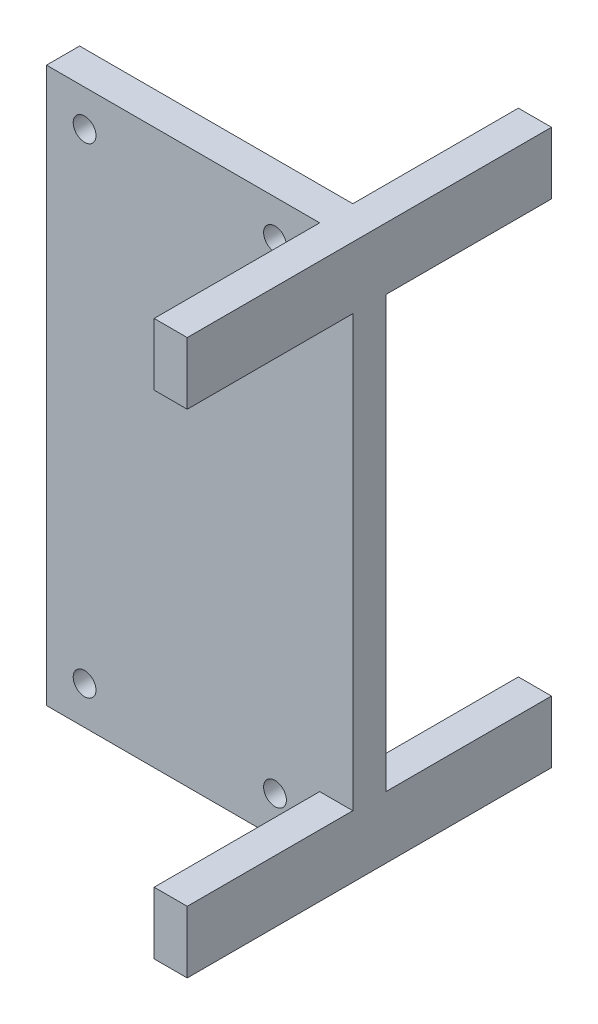
ISO-10303-21;
HEADER;
FILE_DESCRIPTION(('STEP AP214'),'2;1');
FILE_NAME('part.step','',(''),(''),'','','');
FILE_SCHEMA(('AUTOMOTIVE_DESIGN { 1 0 10303 214 1 1 1 1 }'));
ENDSEC;
DATA;
#1=APPLICATION_CONTEXT('core data for automotive mechanical design processes');
#2=APPLICATION_PROTOCOL_DEFINITION('international standard','automotive_design',2000,#1);
#3=PRODUCT_CONTEXT('',#1,'mechanical');
#4=PRODUCT('Part','Part','',(#3));
#5=PRODUCT_RELATED_PRODUCT_CATEGORY('part','',(#4));
#6=PRODUCT_DEFINITION_FORMATION('','',#4);
#7=PRODUCT_DEFINITION_CONTEXT('part definition',#1,'design');
#8=PRODUCT_DEFINITION('design','',#6,#7);
#9=PRODUCT_DEFINITION_SHAPE('','',#8);
#10=(LENGTH_UNIT() NAMED_UNIT(*) SI_UNIT(.MILLI.,.METRE.));
#11=(NAMED_UNIT(*) PLANE_ANGLE_UNIT() SI_UNIT($,.RADIAN.));
#12=(NAMED_UNIT(*) SI_UNIT($,.STERADIAN.) SOLID_ANGLE_UNIT());
#13=UNCERTAINTY_MEASURE_WITH_UNIT(LENGTH_MEASURE(1.E-05),#10,'distance_accuracy_value','');
#14=(GEOMETRIC_REPRESENTATION_CONTEXT(3) GLOBAL_UNCERTAINTY_ASSIGNED_CONTEXT((#13)) GLOBAL_UNIT_ASSIGNED_CONTEXT((#10,
#11,#12)) REPRESENTATION_CONTEXT('',''));
#15=CARTESIAN_POINT('',(0.,0.,0.));
#16=DIRECTION('',(0.,0.,1.));
#17=DIRECTION('',(1.,0.,0.));
#18=AXIS2_PLACEMENT_3D('',#15,#16,#17);
#19=CARTESIAN_POINT('',(0.,0.,0.));
#20=DIRECTION('',(0.,0.,1.));
#21=DIRECTION('',(1.,0.,0.));
#22=AXIS2_PLACEMENT_3D('',#19,#20,#21);
#23=PLANE('',#22);
#24=CARTESIAN_POINT('',(4.60000521271603,62.5999960758975,0.));
#25=DIRECTION('',(0.,0.,1.));
#26=DIRECTION('',(1.,0.,0.));
#27=AXIS2_PLACEMENT_3D('',#24,#25,#26);
#28=CIRCLE('',#27,1.37500005417229);
#29=CARTESIAN_POINT('',(5.97500526688832,62.5999960758975,0.));
#30=VERTEX_POINT('',#29);
#31=EDGE_CURVE('E331',#30,#30,#28,.T.);
#32=ORIENTED_EDGE('',*,*,#31,.T.);
#33=EDGE_LOOP('',(#32));
#34=FACE_BOUND('',#33,.T.);
#35=CARTESIAN_POINT('',(27.6000035015643,62.5999960758975,0.));
#36=DIRECTION('',(0.,0.,1.));
#37=DIRECTION('',(1.,0.,0.));
#38=AXIS2_PLACEMENT_3D('',#35,#36,#37);
#39=CIRCLE('',#38,1.37499760182344);
#40=CARTESIAN_POINT('',(28.9750011033877,62.5999960758975,0.));
#41=VERTEX_POINT('',#40);
#42=EDGE_CURVE('E325',#41,#41,#39,.T.);
#43=ORIENTED_EDGE('',*,*,#42,.T.);
#44=EDGE_LOOP('',(#43));
#45=FACE_BOUND('',#44,.T.);
#46=CARTESIAN_POINT('',(4.59999689017492,4.59999657961699,0.));
#47=DIRECTION('',(0.,0.,1.));
#48=DIRECTION('',(1.,0.,0.));
#49=AXIS2_PLACEMENT_3D('',#46,#47,#48);
#50=CIRCLE('',#49,1.37500005133197);
#51=CARTESIAN_POINT('',(5.97499694150688,4.59999657961699,0.));
#52=VERTEX_POINT('',#51);
#53=EDGE_CURVE('E317',#52,#52,#50,.T.);
#54=ORIENTED_EDGE('',*,*,#53,.T.);
#55=EDGE_LOOP('',(#54));
#56=FACE_BOUND('',#55,.T.);
#57=CARTESIAN_POINT('',(27.6000035015643,4.59999657961699,0.));
#58=DIRECTION('',(0.,0.,1.));
#59=DIRECTION('',(1.,0.,0.));
#60=AXIS2_PLACEMENT_3D('',#57,#58,#59);
#61=CIRCLE('',#60,1.37500106569427);
#62=CARTESIAN_POINT('',(28.9750045672586,4.59999657961699,0.));
#63=VERTEX_POINT('',#62);
#64=EDGE_CURVE('E318',#63,#63,#61,.T.);
#65=ORIENTED_EDGE('',*,*,#64,.T.);
#66=EDGE_LOOP('',(#65));
#67=FACE_BOUND('',#66,.T.);
#68=DIRECTION('',(1.,0.,0.));
#69=VECTOR('',#68,1.);
#70=CARTESIAN_POINT('',(33.,7.5,0.));
#71=LINE('',#70,#69);
#72=CARTESIAN_POINT('',(33.,7.5,0.));
#73=VERTEX_POINT('',#72);
#74=CARTESIAN_POINT('',(37.,7.5,0.));
#75=VERTEX_POINT('',#74);
#76=EDGE_CURVE('E254',#73,#75,#71,.T.);
#77=ORIENTED_EDGE('',*,*,#76,.F.);
#78=DIRECTION('',(0.,-1.,0.));
#79=VECTOR('',#78,1.);
#80=CARTESIAN_POINT('',(33.,7.5,0.));
#81=LINE('',#80,#79);
#82=CARTESIAN_POINT('',(33.,0.,0.));
#83=VERTEX_POINT('',#82);
#84=EDGE_CURVE('E267',#73,#83,#81,.T.);
#85=ORIENTED_EDGE('',*,*,#84,.T.);
#86=DIRECTION('',(1.,0.,0.));
#87=VECTOR('',#86,1.);
#88=CARTESIAN_POINT('',(0.,0.,0.));
#89=LINE('',#88,#87);
#90=CARTESIAN_POINT('',(0.,0.,0.));
#91=VERTEX_POINT('',#90);
#92=EDGE_CURVE('E352',#91,#83,#89,.T.);
#93=ORIENTED_EDGE('',*,*,#92,.F.);
#94=DIRECTION('',(0.,1.,0.));
#95=VECTOR('',#94,1.);
#96=CARTESIAN_POINT('',(0.,0.,0.));
#97=LINE('',#96,#95);
#98=CARTESIAN_POINT('',(0.,67.,0.));
#99=VERTEX_POINT('',#98);
#100=EDGE_CURVE('E344',#91,#99,#97,.T.);
#101=ORIENTED_EDGE('',*,*,#100,.T.);
#102=DIRECTION('',(1.,0.,0.));
#103=VECTOR('',#102,1.);
#104=CARTESIAN_POINT('',(0.,67.,0.));
#105=LINE('',#104,#103);
#106=CARTESIAN_POINT('',(33.,67.,0.));
#107=VERTEX_POINT('',#106);
#108=EDGE_CURVE('E337',#99,#107,#105,.T.);
#109=ORIENTED_EDGE('',*,*,#108,.T.);
#110=DIRECTION('',(0.,1.,0.));
#111=VECTOR('',#110,1.);
#112=CARTESIAN_POINT('',(33.,59.5,0.));
#113=LINE('',#112,#111);
#114=CARTESIAN_POINT('',(33.,59.5,0.));
#115=VERTEX_POINT('',#114);
#116=EDGE_CURVE('E247',#115,#107,#113,.T.);
#117=ORIENTED_EDGE('',*,*,#116,.F.);
#118=DIRECTION('',(1.,0.,0.));
#119=VECTOR('',#118,1.);
#120=CARTESIAN_POINT('',(33.,59.5,0.));
#121=LINE('',#120,#119);
#122=CARTESIAN_POINT('',(37.,59.5,0.));
#123=VERTEX_POINT('',#122);
#124=EDGE_CURVE('E234',#115,#123,#121,.T.);
#125=ORIENTED_EDGE('',*,*,#124,.T.);
#126=DIRECTION('',(0.,1.,0.));
#127=VECTOR('',#126,1.);
#128=CARTESIAN_POINT('',(37.,0.,0.));
#129=LINE('',#128,#127);
#130=EDGE_CURVE('E239',#75,#123,#129,.T.);
#131=ORIENTED_EDGE('',*,*,#130,.F.);
#132=EDGE_LOOP('',(#77,#85,#93,#101,#109,#117,#125,#131));
#133=FACE_BOUND('',#132,.T.);
#134=ADVANCED_FACE('F99',(#34,#45,#56,#67,#133),#23,.F.);
#135=CARTESIAN_POINT('',(0.,0.,4.));
#136=DIRECTION('',(0.,0.,1.));
#137=DIRECTION('',(1.,0.,0.));
#138=AXIS2_PLACEMENT_3D('',#135,#136,#137);
#139=PLANE('',#138);
#140=DIRECTION('',(0.,-1.,0.));
#141=VECTOR('',#140,1.);
#142=CARTESIAN_POINT('',(33.,7.5,4.));
#143=LINE('',#142,#141);
#144=CARTESIAN_POINT('',(33.,7.5,4.));
#145=VERTEX_POINT('',#144);
#146=CARTESIAN_POINT('',(33.,0.,4.));
#147=VERTEX_POINT('',#146);
#148=EDGE_CURVE('E290',#145,#147,#143,.T.);
#149=ORIENTED_EDGE('',*,*,#148,.F.);
#150=DIRECTION('',(1.,0.,0.));
#151=VECTOR('',#150,1.);
#152=CARTESIAN_POINT('',(33.,7.5,4.));
#153=LINE('',#152,#151);
#154=CARTESIAN_POINT('',(37.,7.5,4.));
#155=VERTEX_POINT('',#154);
#156=EDGE_CURVE('E275',#145,#155,#153,.T.);
#157=ORIENTED_EDGE('',*,*,#156,.T.);
#158=DIRECTION('',(0.,1.,0.));
#159=VECTOR('',#158,1.);
#160=CARTESIAN_POINT('',(37.,0.,4.));
#161=LINE('',#160,#159);
#162=CARTESIAN_POINT('',(37.,59.5,4.));
#163=VERTEX_POINT('',#162);
#164=EDGE_CURVE('E358',#155,#163,#161,.T.);
#165=ORIENTED_EDGE('',*,*,#164,.T.);
#166=DIRECTION('',(1.,0.,0.));
#167=VECTOR('',#166,1.);
#168=CARTESIAN_POINT('',(33.,59.5,4.));
#169=LINE('',#168,#167);
#170=CARTESIAN_POINT('',(33.,59.5,4.));
#171=VERTEX_POINT('',#170);
#172=EDGE_CURVE('E311',#171,#163,#169,.T.);
#173=ORIENTED_EDGE('',*,*,#172,.F.);
#174=DIRECTION('',(0.,1.,0.));
#175=VECTOR('',#174,1.);
#176=CARTESIAN_POINT('',(33.,59.5,4.));
#177=LINE('',#176,#175);
#178=CARTESIAN_POINT('',(33.,67.,4.));
#179=VERTEX_POINT('',#178);
#180=EDGE_CURVE('E300',#171,#179,#177,.T.);
#181=ORIENTED_EDGE('',*,*,#180,.T.);
#182=DIRECTION('',(1.,0.,0.));
#183=VECTOR('',#182,1.);
#184=CARTESIAN_POINT('',(0.,67.,4.));
#185=LINE('',#184,#183);
#186=CARTESIAN_POINT('',(0.,67.,4.));
#187=VERTEX_POINT('',#186);
#188=EDGE_CURVE('E340',#187,#179,#185,.T.);
#189=ORIENTED_EDGE('',*,*,#188,.F.);
#190=DIRECTION('',(0.,1.,0.));
#191=VECTOR('',#190,1.);
#192=CARTESIAN_POINT('',(0.,0.,4.));
#193=LINE('',#192,#191);
#194=CARTESIAN_POINT('',(0.,0.,4.));
#195=VERTEX_POINT('',#194);
#196=EDGE_CURVE('E347',#195,#187,#193,.T.);
#197=ORIENTED_EDGE('',*,*,#196,.F.);
#198=DIRECTION('',(1.,0.,0.));
#199=VECTOR('',#198,1.);
#200=CARTESIAN_POINT('',(0.,0.,4.));
#201=LINE('',#200,#199);
#202=EDGE_CURVE('E343',#195,#147,#201,.T.);
#203=ORIENTED_EDGE('',*,*,#202,.T.);
#204=EDGE_LOOP('',(#149,#157,#165,#173,#181,#189,#197,#203));
#205=FACE_BOUND('',#204,.T.);
#206=CARTESIAN_POINT('',(4.59999689017492,4.59999657961699,4.));
#207=DIRECTION('',(0.,0.,1.));
#208=DIRECTION('',(1.,0.,0.));
#209=AXIS2_PLACEMENT_3D('',#206,#207,#208);
#210=CIRCLE('',#209,1.37500005133197);
#211=CARTESIAN_POINT('',(5.97499694150688,4.59999657961699,4.));
#212=VERTEX_POINT('',#211);
#213=EDGE_CURVE('E322',#212,#212,#210,.T.);
#214=ORIENTED_EDGE('',*,*,#213,.F.);
#215=EDGE_LOOP('',(#214));
#216=FACE_BOUND('',#215,.T.);
#217=CARTESIAN_POINT('',(4.60000521271603,62.5999960758975,4.));
#218=DIRECTION('',(0.,0.,1.));
#219=DIRECTION('',(1.,0.,0.));
#220=AXIS2_PLACEMENT_3D('',#217,#218,#219);
#221=CIRCLE('',#220,1.37500005417229);
#222=CARTESIAN_POINT('',(5.97500526688832,62.5999960758975,4.));
#223=VERTEX_POINT('',#222);
#224=EDGE_CURVE('E334',#223,#223,#221,.T.);
#225=ORIENTED_EDGE('',*,*,#224,.F.);
#226=EDGE_LOOP('',(#225));
#227=FACE_BOUND('',#226,.T.);
#228=CARTESIAN_POINT('',(27.6000035015643,62.5999960758975,4.));
#229=DIRECTION('',(0.,0.,1.));
#230=DIRECTION('',(1.,0.,0.));
#231=AXIS2_PLACEMENT_3D('',#228,#229,#230);
#232=CIRCLE('',#231,1.37499760182344);
#233=CARTESIAN_POINT('',(28.9750011033877,62.5999960758975,4.));
#234=VERTEX_POINT('',#233);
#235=EDGE_CURVE('E328',#234,#234,#232,.T.);
#236=ORIENTED_EDGE('',*,*,#235,.F.);
#237=EDGE_LOOP('',(#236));
#238=FACE_BOUND('',#237,.T.);
#239=CARTESIAN_POINT('',(27.6000035015643,4.59999657961699,4.));
#240=DIRECTION('',(0.,0.,1.));
#241=DIRECTION('',(1.,0.,0.));
#242=AXIS2_PLACEMENT_3D('',#239,#240,#241);
#243=CIRCLE('',#242,1.37500106569427);
#244=CARTESIAN_POINT('',(28.9750045672586,4.59999657961699,4.));
#245=VERTEX_POINT('',#244);
#246=EDGE_CURVE('E314',#245,#245,#243,.T.);
#247=ORIENTED_EDGE('',*,*,#246,.F.);
#248=EDGE_LOOP('',(#247));
#249=FACE_BOUND('',#248,.T.);
#250=ADVANCED_FACE('F377',(#205,#216,#227,#238,#249),#139,.T.);
#251=CARTESIAN_POINT('',(0.,67.,4.));
#252=DIRECTION('',(0.,1.,0.));
#253=DIRECTION('',(0.,0.,1.));
#254=AXIS2_PLACEMENT_3D('',#251,#252,#253);
#255=PLANE('',#254);
#256=ORIENTED_EDGE('',*,*,#108,.F.);
#257=DIRECTION('',(0.,0.,-1.));
#258=VECTOR('',#257,1.);
#259=CARTESIAN_POINT('',(0.,67.,4.));
#260=LINE('',#259,#258);
#261=EDGE_CURVE('E12',#187,#99,#260,.T.);
#262=ORIENTED_EDGE('',*,*,#261,.F.);
#263=ORIENTED_EDGE('',*,*,#188,.T.);
#264=DIRECTION('',(0.,0.,1.));
#265=VECTOR('',#264,1.);
#266=CARTESIAN_POINT('',(33.,67.,4.));
#267=LINE('',#266,#265);
#268=CARTESIAN_POINT('',(33.,67.,24.));
#269=VERTEX_POINT('',#268);
#270=EDGE_CURVE('E124',#179,#269,#267,.T.);
#271=ORIENTED_EDGE('',*,*,#270,.T.);
#272=DIRECTION('',(1.,0.,0.));
#273=VECTOR('',#272,1.);
#274=CARTESIAN_POINT('',(33.,67.,24.));
#275=LINE('',#274,#273);
#276=CARTESIAN_POINT('',(37.,67.,24.));
#277=VERTEX_POINT('',#276);
#278=EDGE_CURVE('E308',#269,#277,#275,.T.);
#279=ORIENTED_EDGE('',*,*,#278,.T.);
#280=DIRECTION('',(0.,0.,-1.));
#281=VECTOR('',#280,1.);
#282=CARTESIAN_POINT('',(37.,67.,4.));
#283=LINE('',#282,#281);
#284=CARTESIAN_POINT('',(37.,67.,-20.));
#285=VERTEX_POINT('',#284);
#286=EDGE_CURVE('E103',#277,#285,#283,.T.);
#287=ORIENTED_EDGE('',*,*,#286,.T.);
#288=DIRECTION('',(1.,0.,0.));
#289=VECTOR('',#288,1.);
#290=CARTESIAN_POINT('',(33.,67.,-20.));
#291=LINE('',#290,#289);
#292=CARTESIAN_POINT('',(33.,67.,-20.));
#293=VERTEX_POINT('',#292);
#294=EDGE_CURVE('E223',#293,#285,#291,.T.);
#295=ORIENTED_EDGE('',*,*,#294,.F.);
#296=DIRECTION('',(0.,0.,-1.));
#297=VECTOR('',#296,1.);
#298=CARTESIAN_POINT('',(33.,67.,0.));
#299=LINE('',#298,#297);
#300=EDGE_CURVE('E240',#107,#293,#299,.T.);
#301=ORIENTED_EDGE('',*,*,#300,.F.);
#302=EDGE_LOOP('',(#256,#262,#263,#271,#279,#287,#295,#301));
#303=FACE_BOUND('',#302,.T.);
#304=ADVANCED_FACE('F364',(#303),#255,.T.);
#305=CARTESIAN_POINT('',(0.,0.,4.));
#306=DIRECTION('',(-1.,0.,0.));
#307=DIRECTION('',(0.,0.,1.));
#308=AXIS2_PLACEMENT_3D('',#305,#306,#307);
#309=PLANE('',#308);
#310=ORIENTED_EDGE('',*,*,#100,.F.);
#311=DIRECTION('',(0.,0.,-1.));
#312=VECTOR('',#311,1.);
#313=CARTESIAN_POINT('',(0.,0.,4.));
#314=LINE('',#313,#312);
#315=EDGE_CURVE('E108',#195,#91,#314,.T.);
#316=ORIENTED_EDGE('',*,*,#315,.F.);
#317=ORIENTED_EDGE('',*,*,#196,.T.);
#318=ORIENTED_EDGE('',*,*,#261,.T.);
#319=EDGE_LOOP('',(#310,#316,#317,#318));
#320=FACE_BOUND('',#319,.T.);
#321=ADVANCED_FACE('F407',(#320),#309,.T.);
#322=CARTESIAN_POINT('',(0.,0.,4.));
#323=DIRECTION('',(0.,1.,0.));
#324=DIRECTION('',(0.,0.,1.));
#325=AXIS2_PLACEMENT_3D('',#322,#323,#324);
#326=PLANE('',#325);
#327=ORIENTED_EDGE('',*,*,#92,.T.);
#328=DIRECTION('',(0.,0.,-1.));
#329=VECTOR('',#328,1.);
#330=CARTESIAN_POINT('',(33.,0.,0.));
#331=LINE('',#330,#329);
#332=CARTESIAN_POINT('',(33.,0.,-20.));
#333=VERTEX_POINT('',#332);
#334=EDGE_CURVE('E253',#83,#333,#331,.T.);
#335=ORIENTED_EDGE('',*,*,#334,.T.);
#336=DIRECTION('',(1.,0.,0.));
#337=VECTOR('',#336,1.);
#338=CARTESIAN_POINT('',(33.,0.,-20.));
#339=LINE('',#338,#337);
#340=CARTESIAN_POINT('',(37.,0.,-20.));
#341=VERTEX_POINT('',#340);
#342=EDGE_CURVE('E256',#333,#341,#339,.T.);
#343=ORIENTED_EDGE('',*,*,#342,.T.);
#344=DIRECTION('',(0.,0.,-1.));
#345=VECTOR('',#344,1.);
#346=CARTESIAN_POINT('',(37.,0.,4.));
#347=LINE('',#346,#345);
#348=CARTESIAN_POINT('',(37.,0.,24.));
#349=VERTEX_POINT('',#348);
#350=EDGE_CURVE('E321',#349,#341,#347,.T.);
#351=ORIENTED_EDGE('',*,*,#350,.F.);
#352=DIRECTION('',(1.,0.,0.));
#353=VECTOR('',#352,1.);
#354=CARTESIAN_POINT('',(33.,0.,24.));
#355=LINE('',#354,#353);
#356=CARTESIAN_POINT('',(33.,0.,24.));
#357=VERTEX_POINT('',#356);
#358=EDGE_CURVE('E277',#357,#349,#355,.T.);
#359=ORIENTED_EDGE('',*,*,#358,.F.);
#360=DIRECTION('',(0.,0.,1.));
#361=VECTOR('',#360,1.);
#362=CARTESIAN_POINT('',(33.,0.,4.));
#363=LINE('',#362,#361);
#364=EDGE_CURVE('E288',#147,#357,#363,.T.);
#365=ORIENTED_EDGE('',*,*,#364,.F.);
#366=ORIENTED_EDGE('',*,*,#202,.F.);
#367=ORIENTED_EDGE('',*,*,#315,.T.);
#368=EDGE_LOOP('',(#327,#335,#343,#351,#359,#365,#366,#367));
#369=FACE_BOUND('',#368,.T.);
#370=ADVANCED_FACE('F392',(#369),#326,.F.);
#371=CARTESIAN_POINT('',(4.60000521271603,62.5999960758975,4.));
#372=DIRECTION('',(0.,0.,-1.));
#373=DIRECTION('',(-1.,0.,0.));
#374=AXIS2_PLACEMENT_3D('',#371,#372,#373);
#375=CYLINDRICAL_SURFACE('',#374,1.37500005417229);
#376=ORIENTED_EDGE('',*,*,#224,.T.);
#377=EDGE_LOOP('',(#376));
#378=FACE_BOUND('',#377,.T.);
#379=ORIENTED_EDGE('',*,*,#31,.F.);
#380=EDGE_LOOP('',(#379));
#381=FACE_BOUND('',#380,.T.);
#382=ADVANCED_FACE('F415',(#378,#381),#375,.F.);
#383=CARTESIAN_POINT('',(27.6000035015643,62.5999960758975,4.));
#384=DIRECTION('',(0.,0.,-1.));
#385=DIRECTION('',(-1.,0.,0.));
#386=AXIS2_PLACEMENT_3D('',#383,#384,#385);
#387=CYLINDRICAL_SURFACE('',#386,1.37499760182344);
#388=ORIENTED_EDGE('',*,*,#235,.T.);
#389=EDGE_LOOP('',(#388));
#390=FACE_BOUND('',#389,.T.);
#391=ORIENTED_EDGE('',*,*,#42,.F.);
#392=EDGE_LOOP('',(#391));
#393=FACE_BOUND('',#392,.T.);
#394=ADVANCED_FACE('F439',(#390,#393),#387,.F.);
#395=CARTESIAN_POINT('',(4.59999689017492,4.59999657961699,4.));
#396=DIRECTION('',(0.,0.,-1.));
#397=DIRECTION('',(-1.,0.,0.));
#398=AXIS2_PLACEMENT_3D('',#395,#396,#397);
#399=CYLINDRICAL_SURFACE('',#398,1.37500005133197);
#400=ORIENTED_EDGE('',*,*,#213,.T.);
#401=EDGE_LOOP('',(#400));
#402=FACE_BOUND('',#401,.T.);
#403=ORIENTED_EDGE('',*,*,#53,.F.);
#404=EDGE_LOOP('',(#403));
#405=FACE_BOUND('',#404,.T.);
#406=ADVANCED_FACE('F433',(#402,#405),#399,.F.);
#407=CARTESIAN_POINT('',(27.6000035015643,4.59999657961699,4.));
#408=DIRECTION('',(0.,0.,-1.));
#409=DIRECTION('',(-1.,0.,0.));
#410=AXIS2_PLACEMENT_3D('',#407,#408,#409);
#411=CYLINDRICAL_SURFACE('',#410,1.37500106569427);
#412=ORIENTED_EDGE('',*,*,#246,.T.);
#413=EDGE_LOOP('',(#412));
#414=FACE_BOUND('',#413,.T.);
#415=ORIENTED_EDGE('',*,*,#64,.F.);
#416=EDGE_LOOP('',(#415));
#417=FACE_BOUND('',#416,.T.);
#418=ADVANCED_FACE('F428',(#414,#417),#411,.F.);
#419=CARTESIAN_POINT('',(37.,0.,4.));
#420=DIRECTION('',(-1.,0.,0.));
#421=DIRECTION('',(0.,0.,1.));
#422=AXIS2_PLACEMENT_3D('',#419,#420,#421);
#423=PLANE('',#422);
#424=ORIENTED_EDGE('',*,*,#350,.T.);
#425=DIRECTION('',(0.,1.,0.));
#426=VECTOR('',#425,1.);
#427=CARTESIAN_POINT('',(37.,0.,-20.));
#428=LINE('',#427,#426);
#429=CARTESIAN_POINT('',(37.,7.5,-20.));
#430=VERTEX_POINT('',#429);
#431=EDGE_CURVE('E261',#341,#430,#428,.T.);
#432=ORIENTED_EDGE('',*,*,#431,.T.);
#433=DIRECTION('',(0.,0.,1.));
#434=VECTOR('',#433,1.);
#435=CARTESIAN_POINT('',(37.,7.5,-20.));
#436=LINE('',#435,#434);
#437=EDGE_CURVE('E259',#430,#75,#436,.T.);
#438=ORIENTED_EDGE('',*,*,#437,.T.);
#439=ORIENTED_EDGE('',*,*,#130,.T.);
#440=DIRECTION('',(0.,0.,1.));
#441=VECTOR('',#440,1.);
#442=CARTESIAN_POINT('',(37.,59.5,-20.));
#443=LINE('',#442,#441);
#444=CARTESIAN_POINT('',(37.,59.5,-20.));
#445=VERTEX_POINT('',#444);
#446=EDGE_CURVE('E227',#445,#123,#443,.T.);
#447=ORIENTED_EDGE('',*,*,#446,.F.);
#448=DIRECTION('',(0.,-1.,0.));
#449=VECTOR('',#448,1.);
#450=CARTESIAN_POINT('',(37.,67.,-20.));
#451=LINE('',#450,#449);
#452=EDGE_CURVE('E217',#285,#445,#451,.T.);
#453=ORIENTED_EDGE('',*,*,#452,.F.);
#454=ORIENTED_EDGE('',*,*,#286,.F.);
#455=DIRECTION('',(0.,-1.,0.));
#456=VECTOR('',#455,1.);
#457=CARTESIAN_POINT('',(37.,67.,24.));
#458=LINE('',#457,#456);
#459=CARTESIAN_POINT('',(37.,59.5,24.));
#460=VERTEX_POINT('',#459);
#461=EDGE_CURVE('E226',#277,#460,#458,.T.);
#462=ORIENTED_EDGE('',*,*,#461,.T.);
#463=DIRECTION('',(0.,0.,-1.));
#464=VECTOR('',#463,1.);
#465=CARTESIAN_POINT('',(37.,59.5,24.));
#466=LINE('',#465,#464);
#467=EDGE_CURVE('E297',#460,#163,#466,.T.);
#468=ORIENTED_EDGE('',*,*,#467,.T.);
#469=ORIENTED_EDGE('',*,*,#164,.F.);
#470=DIRECTION('',(0.,0.,-1.));
#471=VECTOR('',#470,1.);
#472=CARTESIAN_POINT('',(37.,7.5,24.));
#473=LINE('',#472,#471);
#474=CARTESIAN_POINT('',(37.,7.5,24.));
#475=VERTEX_POINT('',#474);
#476=EDGE_CURVE('E116',#475,#155,#473,.T.);
#477=ORIENTED_EDGE('',*,*,#476,.F.);
#478=DIRECTION('',(0.,1.,0.));
#479=VECTOR('',#478,1.);
#480=CARTESIAN_POINT('',(37.,0.,24.));
#481=LINE('',#480,#479);
#482=EDGE_CURVE('E283',#349,#475,#481,.T.);
#483=ORIENTED_EDGE('',*,*,#482,.F.);
#484=EDGE_LOOP('',(#424,#432,#438,#439,#447,#453,#454,#462,#468,#469,#477,#483));
#485=FACE_BOUND('',#484,.T.);
#486=ADVANCED_FACE('F101',(#485),#423,.F.);
#487=CARTESIAN_POINT('',(33.,67.,-20.));
#488=DIRECTION('',(0.,0.,1.));
#489=DIRECTION('',(1.,0.,0.));
#490=AXIS2_PLACEMENT_3D('',#487,#488,#489);
#491=PLANE('',#490);
#492=ORIENTED_EDGE('',*,*,#452,.T.);
#493=DIRECTION('',(1.,0.,0.));
#494=VECTOR('',#493,1.);
#495=CARTESIAN_POINT('',(33.,59.5,-20.));
#496=LINE('',#495,#494);
#497=CARTESIAN_POINT('',(33.,59.5,-20.));
#498=VERTEX_POINT('',#497);
#499=EDGE_CURVE('E220',#498,#445,#496,.T.);
#500=ORIENTED_EDGE('',*,*,#499,.F.);
#501=DIRECTION('',(0.,-1.,0.));
#502=VECTOR('',#501,1.);
#503=CARTESIAN_POINT('',(33.,67.,-20.));
#504=LINE('',#503,#502);
#505=EDGE_CURVE('E243',#293,#498,#504,.T.);
#506=ORIENTED_EDGE('',*,*,#505,.F.);
#507=ORIENTED_EDGE('',*,*,#294,.T.);
#508=EDGE_LOOP('',(#492,#500,#506,#507));
#509=FACE_BOUND('',#508,.T.);
#510=ADVANCED_FACE('F219',(#509),#491,.F.);
#511=CARTESIAN_POINT('',(33.,59.5,-20.));
#512=DIRECTION('',(0.,1.,0.));
#513=DIRECTION('',(0.,0.,1.));
#514=AXIS2_PLACEMENT_3D('',#511,#512,#513);
#515=PLANE('',#514);
#516=ORIENTED_EDGE('',*,*,#446,.T.);
#517=ORIENTED_EDGE('',*,*,#124,.F.);
#518=DIRECTION('',(0.,0.,1.));
#519=VECTOR('',#518,1.);
#520=CARTESIAN_POINT('',(33.,59.5,-20.));
#521=LINE('',#520,#519);
#522=EDGE_CURVE('E233',#498,#115,#521,.T.);
#523=ORIENTED_EDGE('',*,*,#522,.F.);
#524=ORIENTED_EDGE('',*,*,#499,.T.);
#525=EDGE_LOOP('',(#516,#517,#523,#524));
#526=FACE_BOUND('',#525,.T.);
#527=ADVANCED_FACE('F230',(#526),#515,.F.);
#528=CARTESIAN_POINT('',(33.,0.,0.));
#529=DIRECTION('',(-1.,0.,0.));
#530=DIRECTION('',(0.,0.,1.));
#531=AXIS2_PLACEMENT_3D('',#528,#529,#530);
#532=PLANE('',#531);
#533=ORIENTED_EDGE('',*,*,#300,.T.);
#534=ORIENTED_EDGE('',*,*,#505,.T.);
#535=ORIENTED_EDGE('',*,*,#522,.T.);
#536=ORIENTED_EDGE('',*,*,#116,.T.);
#537=EDGE_LOOP('',(#533,#534,#535,#536));
#538=FACE_BOUND('',#537,.T.);
#539=ADVANCED_FACE('F403',(#538),#532,.T.);
#540=CARTESIAN_POINT('',(33.,0.,-20.));
#541=DIRECTION('',(0.,0.,-1.));
#542=DIRECTION('',(-1.,0.,0.));
#543=AXIS2_PLACEMENT_3D('',#540,#541,#542);
#544=PLANE('',#543);
#545=ORIENTED_EDGE('',*,*,#431,.F.);
#546=ORIENTED_EDGE('',*,*,#342,.F.);
#547=DIRECTION('',(0.,1.,0.));
#548=VECTOR('',#547,1.);
#549=CARTESIAN_POINT('',(33.,0.,-20.));
#550=LINE('',#549,#548);
#551=CARTESIAN_POINT('',(33.,7.5,-20.));
#552=VERTEX_POINT('',#551);
#553=EDGE_CURVE('E262',#333,#552,#550,.T.);
#554=ORIENTED_EDGE('',*,*,#553,.T.);
#555=DIRECTION('',(1.,0.,0.));
#556=VECTOR('',#555,1.);
#557=CARTESIAN_POINT('',(33.,7.5,-20.));
#558=LINE('',#557,#556);
#559=EDGE_CURVE('E251',#552,#430,#558,.T.);
#560=ORIENTED_EDGE('',*,*,#559,.T.);
#561=EDGE_LOOP('',(#545,#546,#554,#560));
#562=FACE_BOUND('',#561,.T.);
#563=ADVANCED_FACE('F396',(#562),#544,.T.);
#564=CARTESIAN_POINT('',(33.,7.5,-20.));
#565=DIRECTION('',(0.,1.,0.));
#566=DIRECTION('',(0.,0.,1.));
#567=AXIS2_PLACEMENT_3D('',#564,#565,#566);
#568=PLANE('',#567);
#569=ORIENTED_EDGE('',*,*,#437,.F.);
#570=ORIENTED_EDGE('',*,*,#559,.F.);
#571=DIRECTION('',(0.,0.,1.));
#572=VECTOR('',#571,1.);
#573=CARTESIAN_POINT('',(33.,7.5,-20.));
#574=LINE('',#573,#572);
#575=EDGE_CURVE('E270',#552,#73,#574,.T.);
#576=ORIENTED_EDGE('',*,*,#575,.T.);
#577=ORIENTED_EDGE('',*,*,#76,.T.);
#578=EDGE_LOOP('',(#569,#570,#576,#577));
#579=FACE_BOUND('',#578,.T.);
#580=ADVANCED_FACE('F564',(#579),#568,.T.);
#581=CARTESIAN_POINT('',(33.,0.,0.));
#582=DIRECTION('',(1.,0.,0.));
#583=DIRECTION('',(0.,0.,-1.));
#584=AXIS2_PLACEMENT_3D('',#581,#582,#583);
#585=PLANE('',#584);
#586=ORIENTED_EDGE('',*,*,#553,.F.);
#587=ORIENTED_EDGE('',*,*,#334,.F.);
#588=ORIENTED_EDGE('',*,*,#84,.F.);
#589=ORIENTED_EDGE('',*,*,#575,.F.);
#590=EDGE_LOOP('',(#586,#587,#588,#589));
#591=FACE_BOUND('',#590,.T.);
#592=ADVANCED_FACE('F572',(#591),#585,.F.);
#593=CARTESIAN_POINT('',(33.,67.,24.));
#594=DIRECTION('',(0.,0.,1.));
#595=DIRECTION('',(1.,0.,0.));
#596=AXIS2_PLACEMENT_3D('',#593,#594,#595);
#597=PLANE('',#596);
#598=ORIENTED_EDGE('',*,*,#461,.F.);
#599=ORIENTED_EDGE('',*,*,#278,.F.);
#600=DIRECTION('',(0.,-1.,0.));
#601=VECTOR('',#600,1.);
#602=CARTESIAN_POINT('',(33.,67.,24.));
#603=LINE('',#602,#601);
#604=CARTESIAN_POINT('',(33.,59.5,24.));
#605=VERTEX_POINT('',#604);
#606=EDGE_CURVE('E293',#269,#605,#603,.T.);
#607=ORIENTED_EDGE('',*,*,#606,.T.);
#608=DIRECTION('',(1.,0.,0.));
#609=VECTOR('',#608,1.);
#610=CARTESIAN_POINT('',(33.,59.5,24.));
#611=LINE('',#610,#609);
#612=EDGE_CURVE('E303',#605,#460,#611,.T.);
#613=ORIENTED_EDGE('',*,*,#612,.T.);
#614=EDGE_LOOP('',(#598,#599,#607,#613));
#615=FACE_BOUND('',#614,.T.);
#616=ADVANCED_FACE('F370',(#615),#597,.T.);
#617=CARTESIAN_POINT('',(33.,59.5,24.));
#618=DIRECTION('',(0.,-1.,0.));
#619=DIRECTION('',(0.,0.,-1.));
#620=AXIS2_PLACEMENT_3D('',#617,#618,#619);
#621=PLANE('',#620);
#622=ORIENTED_EDGE('',*,*,#467,.F.);
#623=ORIENTED_EDGE('',*,*,#612,.F.);
#624=DIRECTION('',(0.,0.,-1.));
#625=VECTOR('',#624,1.);
#626=CARTESIAN_POINT('',(33.,59.5,24.));
#627=LINE('',#626,#625);
#628=EDGE_CURVE('E296',#605,#171,#627,.T.);
#629=ORIENTED_EDGE('',*,*,#628,.T.);
#630=ORIENTED_EDGE('',*,*,#172,.T.);
#631=EDGE_LOOP('',(#622,#623,#629,#630));
#632=FACE_BOUND('',#631,.T.);
#633=ADVANCED_FACE('F373',(#632),#621,.T.);
#634=CARTESIAN_POINT('',(33.,0.,0.));
#635=DIRECTION('',(1.,0.,0.));
#636=DIRECTION('',(0.,0.,-1.));
#637=AXIS2_PLACEMENT_3D('',#634,#635,#636);
#638=PLANE('',#637);
#639=ORIENTED_EDGE('',*,*,#606,.F.);
#640=ORIENTED_EDGE('',*,*,#270,.F.);
#641=ORIENTED_EDGE('',*,*,#180,.F.);
#642=ORIENTED_EDGE('',*,*,#628,.F.);
#643=EDGE_LOOP('',(#639,#640,#641,#642));
#644=FACE_BOUND('',#643,.T.);
#645=ADVANCED_FACE('F594',(#644),#638,.F.);
#646=CARTESIAN_POINT('',(33.,7.5,24.));
#647=DIRECTION('',(0.,-1.,0.));
#648=DIRECTION('',(0.,0.,-1.));
#649=AXIS2_PLACEMENT_3D('',#646,#647,#648);
#650=PLANE('',#649);
#651=ORIENTED_EDGE('',*,*,#476,.T.);
#652=ORIENTED_EDGE('',*,*,#156,.F.);
#653=DIRECTION('',(0.,0.,-1.));
#654=VECTOR('',#653,1.);
#655=CARTESIAN_POINT('',(33.,7.5,24.));
#656=LINE('',#655,#654);
#657=CARTESIAN_POINT('',(33.,7.5,24.));
#658=VERTEX_POINT('',#657);
#659=EDGE_CURVE('E285',#658,#145,#656,.T.);
#660=ORIENTED_EDGE('',*,*,#659,.F.);
#661=DIRECTION('',(1.,0.,0.));
#662=VECTOR('',#661,1.);
#663=CARTESIAN_POINT('',(33.,7.5,24.));
#664=LINE('',#663,#662);
#665=EDGE_CURVE('E280',#658,#475,#664,.T.);
#666=ORIENTED_EDGE('',*,*,#665,.T.);
#667=EDGE_LOOP('',(#651,#652,#660,#666));
#668=FACE_BOUND('',#667,.T.);
#669=ADVANCED_FACE('F386',(#668),#650,.F.);
#670=CARTESIAN_POINT('',(33.,0.,24.));
#671=DIRECTION('',(0.,0.,-1.));
#672=DIRECTION('',(-1.,0.,0.));
#673=AXIS2_PLACEMENT_3D('',#670,#671,#672);
#674=PLANE('',#673);
#675=ORIENTED_EDGE('',*,*,#482,.T.);
#676=ORIENTED_EDGE('',*,*,#665,.F.);
#677=DIRECTION('',(0.,1.,0.));
#678=VECTOR('',#677,1.);
#679=CARTESIAN_POINT('',(33.,0.,24.));
#680=LINE('',#679,#678);
#681=EDGE_CURVE('E282',#357,#658,#680,.T.);
#682=ORIENTED_EDGE('',*,*,#681,.F.);
#683=ORIENTED_EDGE('',*,*,#358,.T.);
#684=EDGE_LOOP('',(#675,#676,#682,#683));
#685=FACE_BOUND('',#684,.T.);
#686=ADVANCED_FACE('F382',(#685),#674,.F.);
#687=CARTESIAN_POINT('',(33.,0.,0.));
#688=DIRECTION('',(-1.,0.,0.));
#689=DIRECTION('',(0.,0.,1.));
#690=AXIS2_PLACEMENT_3D('',#687,#688,#689);
#691=PLANE('',#690);
#692=ORIENTED_EDGE('',*,*,#659,.T.);
#693=ORIENTED_EDGE('',*,*,#148,.T.);
#694=ORIENTED_EDGE('',*,*,#364,.T.);
#695=ORIENTED_EDGE('',*,*,#681,.T.);
#696=EDGE_LOOP('',(#692,#693,#694,#695));
#697=FACE_BOUND('',#696,.T.);
#698=ADVANCED_FACE('F388',(#697),#691,.T.);
#699=CLOSED_SHELL('',(#134,#250,#304,#321,#370,#382,#394,#406,#418,#486,#510,#527,#539,#563,
#580,#592,#616,#633,#645,#669,#686,#698));
#700=MANIFOLD_SOLID_BREP('B2',#699);
#701=ADVANCED_BREP_SHAPE_REPRESENTATION('',(#18,#700),#14);
#702=SHAPE_DEFINITION_REPRESENTATION(#9,#701);
ENDSEC;
END-ISO-10303-21;
